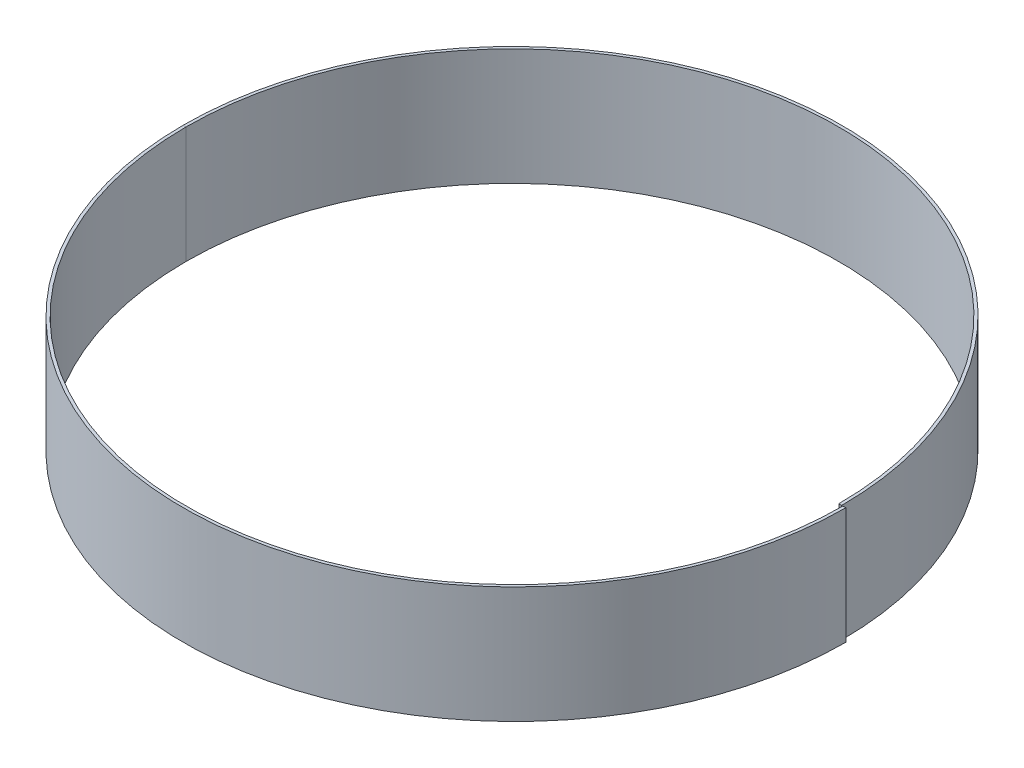
ISO-10303-21;
HEADER;
FILE_DESCRIPTION(('STEP AP214'),'2;1');
FILE_NAME('part.step','',(''),(''),'','','');
FILE_SCHEMA(('AUTOMOTIVE_DESIGN { 1 0 10303 214 1 1 1 1 }'));
ENDSEC;
DATA;
#1=APPLICATION_CONTEXT('core data for automotive mechanical design processes');
#2=APPLICATION_PROTOCOL_DEFINITION('international standard','automotive_design',2000,#1);
#3=PRODUCT_CONTEXT('',#1,'mechanical');
#4=PRODUCT('Part','Part','',(#3));
#5=PRODUCT_RELATED_PRODUCT_CATEGORY('part','',(#4));
#6=PRODUCT_DEFINITION_FORMATION('','',#4);
#7=PRODUCT_DEFINITION_CONTEXT('part definition',#1,'design');
#8=PRODUCT_DEFINITION('design','',#6,#7);
#9=PRODUCT_DEFINITION_SHAPE('','',#8);
#10=(LENGTH_UNIT() NAMED_UNIT(*) SI_UNIT(.MILLI.,.METRE.));
#11=(NAMED_UNIT(*) PLANE_ANGLE_UNIT() SI_UNIT($,.RADIAN.));
#12=(NAMED_UNIT(*) SI_UNIT($,.STERADIAN.) SOLID_ANGLE_UNIT());
#13=UNCERTAINTY_MEASURE_WITH_UNIT(LENGTH_MEASURE(1.E-05),#10,'distance_accuracy_value','');
#14=(GEOMETRIC_REPRESENTATION_CONTEXT(3) GLOBAL_UNCERTAINTY_ASSIGNED_CONTEXT((#13)) GLOBAL_UNIT_ASSIGNED_CONTEXT((#10,
#11,#12)) REPRESENTATION_CONTEXT('',''));
#15=CARTESIAN_POINT('',(0.,0.,0.));
#16=DIRECTION('',(0.,0.,1.));
#17=DIRECTION('',(1.,0.,0.));
#18=AXIS2_PLACEMENT_3D('',#15,#16,#17);
#19=CARTESIAN_POINT('',(28.,-5.,0.));
#20=DIRECTION('',(0.,0.,-1.));
#21=DIRECTION('',(0.,1.,0.));
#22=AXIS2_PLACEMENT_3D('',#19,#20,#21);
#23=PLANE('',#22);
#24=DIRECTION('',(-1.,0.,0.));
#25=VECTOR('',#24,1.);
#26=CARTESIAN_POINT('',(28.,-9.99999999999999,0.));
#27=LINE('',#26,#25);
#28=CARTESIAN_POINT('',(28.25,-9.99999999999999,0.));
#29=VERTEX_POINT('',#28);
#30=CARTESIAN_POINT('',(28.,-9.99999999999999,0.));
#31=VERTEX_POINT('',#30);
#32=EDGE_CURVE('E72',#29,#31,#27,.T.);
#33=ORIENTED_EDGE('',*,*,#32,.F.);
#34=DIRECTION('',(0.,-1.,0.));
#35=VECTOR('',#34,1.);
#36=CARTESIAN_POINT('',(28.25,83.9217284685272,0.));
#37=LINE('',#36,#35);
#38=CARTESIAN_POINT('',(28.25,0.,0.));
#39=VERTEX_POINT('',#38);
#40=EDGE_CURVE('E147',#29,#39,#37,.F.);
#41=ORIENTED_EDGE('',*,*,#40,.T.);
#42=DIRECTION('',(-1.,0.,0.));
#43=VECTOR('',#42,1.);
#44=CARTESIAN_POINT('',(28.,0.,0.));
#45=LINE('',#44,#43);
#46=CARTESIAN_POINT('',(28.,0.,0.));
#47=VERTEX_POINT('',#46);
#48=EDGE_CURVE('E58',#39,#47,#45,.T.);
#49=ORIENTED_EDGE('',*,*,#48,.T.);
#50=DIRECTION('',(0.,1.,0.));
#51=VECTOR('',#50,1.);
#52=CARTESIAN_POINT('',(28.,-9.99999999999999,0.));
#53=LINE('',#52,#51);
#54=EDGE_CURVE('E138',#31,#47,#53,.T.);
#55=ORIENTED_EDGE('',*,*,#54,.F.);
#56=EDGE_LOOP('',(#33,#41,#49,#55));
#57=FACE_BOUND('',#56,.T.);
#58=ADVANCED_FACE('F39',(#57),#23,.F.);
#59=CARTESIAN_POINT('',(0.,83.9217284685272,0.));
#60=DIRECTION('',(0.,-1.,0.));
#61=DIRECTION('',(0.,0.,-1.));
#62=AXIS2_PLACEMENT_3D('',#59,#60,#61);
#63=CYLINDRICAL_SURFACE('',#62,28.);
#64=CARTESIAN_POINT('',(0.,0.,0.));
#65=DIRECTION('',(0.,1.,0.));
#66=DIRECTION('',(0.,0.,1.));
#67=AXIS2_PLACEMENT_3D('',#64,#65,#66);
#68=CIRCLE('',#67,28.);
#69=CARTESIAN_POINT('',(-28.,0.,1.67335087613754E-13));
#70=VERTEX_POINT('',#69);
#71=EDGE_CURVE('E144',#47,#70,#68,.T.);
#72=ORIENTED_EDGE('',*,*,#71,.T.);
#73=DIRECTION('',(0.,1.,0.));
#74=VECTOR('',#73,1.);
#75=CARTESIAN_POINT('',(-28.,-10.,-3.88578058618805E-13));
#76=LINE('',#75,#74);
#77=CARTESIAN_POINT('',(-28.,-9.99999999999999,-1.78031315748604E-13));
#78=VERTEX_POINT('',#77);
#79=EDGE_CURVE('E43',#78,#70,#76,.T.);
#80=ORIENTED_EDGE('',*,*,#79,.F.);
#81=CARTESIAN_POINT('',(0.,-9.99999999999999,0.));
#82=DIRECTION('',(0.,-1.,0.));
#83=DIRECTION('',(0.,0.,-1.));
#84=AXIS2_PLACEMENT_3D('',#81,#82,#83);
#85=CIRCLE('',#84,28.);
#86=EDGE_CURVE('E141',#78,#31,#85,.T.);
#87=ORIENTED_EDGE('',*,*,#86,.T.);
#88=ORIENTED_EDGE('',*,*,#54,.T.);
#89=EDGE_LOOP('',(#72,#80,#87,#88));
#90=FACE_BOUND('',#89,.T.);
#91=ADVANCED_FACE('F155',(#90),#63,.F.);
#92=CARTESIAN_POINT('',(0.,-9.99999999999999,0.));
#93=DIRECTION('',(0.,1.,0.));
#94=DIRECTION('',(0.,0.,1.));
#95=AXIS2_PLACEMENT_3D('',#92,#93,#94);
#96=PLANE('',#95);
#97=DIRECTION('',(-1.,0.,0.));
#98=VECTOR('',#97,1.);
#99=CARTESIAN_POINT('',(-28.,-10.,-3.88578058618805E-13));
#100=LINE('',#99,#98);
#101=CARTESIAN_POINT('',(-28.25,-10.,-3.88578058618805E-13));
#102=VERTEX_POINT('',#101);
#103=EDGE_CURVE('E135',#78,#102,#100,.T.);
#104=ORIENTED_EDGE('',*,*,#103,.T.);
#105=CARTESIAN_POINT('',(0.,-9.99999999999999,0.));
#106=DIRECTION('',(0.,-1.,0.));
#107=DIRECTION('',(0.,0.,-1.));
#108=AXIS2_PLACEMENT_3D('',#105,#106,#107);
#109=CIRCLE('',#108,28.25);
#110=EDGE_CURVE('E132',#102,#29,#109,.T.);
#111=ORIENTED_EDGE('',*,*,#110,.T.);
#112=ORIENTED_EDGE('',*,*,#32,.T.);
#113=ORIENTED_EDGE('',*,*,#86,.F.);
#114=EDGE_LOOP('',(#104,#111,#112,#113));
#115=FACE_BOUND('',#114,.T.);
#116=ADVANCED_FACE('F159',(#115),#96,.F.);
#117=CARTESIAN_POINT('',(0.,83.9217284685272,0.));
#118=DIRECTION('',(0.,-1.,0.));
#119=DIRECTION('',(0.,0.,-1.));
#120=AXIS2_PLACEMENT_3D('',#117,#118,#119);
#121=CYLINDRICAL_SURFACE('',#120,28.25);
#122=CARTESIAN_POINT('',(0.,0.,0.));
#123=DIRECTION('',(0.,-1.,0.));
#124=DIRECTION('',(0.,0.,-1.));
#125=AXIS2_PLACEMENT_3D('',#122,#123,#124);
#126=CIRCLE('',#125,28.25);
#127=CARTESIAN_POINT('',(-28.25,0.,0.));
#128=VERTEX_POINT('',#127);
#129=EDGE_CURVE('E49',#39,#128,#126,.F.);
#130=ORIENTED_EDGE('',*,*,#129,.F.);
#131=ORIENTED_EDGE('',*,*,#40,.F.);
#132=ORIENTED_EDGE('',*,*,#110,.F.);
#133=DIRECTION('',(0.,1.,0.));
#134=VECTOR('',#133,1.);
#135=CARTESIAN_POINT('',(-28.25,-10.,-3.88578058618805E-13));
#136=LINE('',#135,#134);
#137=EDGE_CURVE('E117',#102,#128,#136,.T.);
#138=ORIENTED_EDGE('',*,*,#137,.T.);
#139=EDGE_LOOP('',(#130,#131,#132,#138));
#140=FACE_BOUND('',#139,.T.);
#141=ADVANCED_FACE('F157',(#140),#121,.T.);
#142=CARTESIAN_POINT('',(0.,0.,0.));
#143=DIRECTION('',(0.,-1.,0.));
#144=DIRECTION('',(0.,0.,-1.));
#145=AXIS2_PLACEMENT_3D('',#142,#143,#144);
#146=PLANE('',#145);
#147=ORIENTED_EDGE('',*,*,#48,.F.);
#148=ORIENTED_EDGE('',*,*,#129,.T.);
#149=DIRECTION('',(1.,0.,0.));
#150=VECTOR('',#149,1.);
#151=CARTESIAN_POINT('',(-28.25,0.,-3.88578058618805E-13));
#152=LINE('',#151,#150);
#153=EDGE_CURVE('E11',#128,#70,#152,.T.);
#154=ORIENTED_EDGE('',*,*,#153,.T.);
#155=ORIENTED_EDGE('',*,*,#71,.F.);
#156=EDGE_LOOP('',(#147,#148,#154,#155));
#157=FACE_BOUND('',#156,.T.);
#158=ADVANCED_FACE('F41',(#157),#146,.F.);
#159=CARTESIAN_POINT('',(0.174999999999998,-9.99999999999999,-3.83402395083908E-13));
#160=DIRECTION('',(0.,1.,0.));
#161=DIRECTION('',(0.,0.,1.));
#162=AXIS2_PLACEMENT_3D('',#159,#160,#161);
#163=PLANE('',#162);
#164=DIRECTION('',(-1.,0.,0.));
#165=VECTOR('',#164,1.);
#166=CARTESIAN_POINT('',(28.35,-9.99999999999999,-3.78871509518444E-13));
#167=LINE('',#166,#165);
#168=CARTESIAN_POINT('',(28.6,-9.99999999999999,-3.78831306452202E-13));
#169=VERTEX_POINT('',#168);
#170=CARTESIAN_POINT('',(28.35,-9.99999999999999,-3.78871509518444E-13));
#171=VERTEX_POINT('',#170);
#172=EDGE_CURVE('E101',#169,#171,#167,.T.);
#173=ORIENTED_EDGE('',*,*,#172,.F.);
#174=CARTESIAN_POINT('',(0.174999999999998,-9.99999999999999,-3.83402395083908E-13));
#175=DIRECTION('',(0.,-1.,0.));
#176=DIRECTION('',(0.,0.,-1.));
#177=AXIS2_PLACEMENT_3D('',#174,#175,#176);
#178=CIRCLE('',#177,28.425);
#179=EDGE_CURVE('E80',#169,#102,#178,.T.);
#180=ORIENTED_EDGE('',*,*,#179,.T.);
#181=ORIENTED_EDGE('',*,*,#103,.F.);
#182=CARTESIAN_POINT('',(0.174999999999998,-9.99999999999999,-3.83402395083908E-13));
#183=DIRECTION('',(0.,-1.,0.));
#184=DIRECTION('',(0.,0.,-1.));
#185=AXIS2_PLACEMENT_3D('',#182,#183,#184);
#186=CIRCLE('',#185,28.175);
#187=EDGE_CURVE('E105',#171,#78,#186,.T.);
#188=ORIENTED_EDGE('',*,*,#187,.F.);
#189=EDGE_LOOP('',(#173,#180,#181,#188));
#190=FACE_BOUND('',#189,.T.);
#191=ADVANCED_FACE('F102',(#190),#163,.F.);
#192=CARTESIAN_POINT('',(0.174999999999998,0.,-3.83402395083908E-13));
#193=DIRECTION('',(0.,-1.,0.));
#194=DIRECTION('',(0.,0.,-1.));
#195=AXIS2_PLACEMENT_3D('',#192,#193,#194);
#196=PLANE('',#195);
#197=ORIENTED_EDGE('',*,*,#153,.F.);
#198=CARTESIAN_POINT('',(0.174999999999998,0.,-3.83402395083908E-13));
#199=DIRECTION('',(0.,-1.,0.));
#200=DIRECTION('',(0.,0.,-1.));
#201=AXIS2_PLACEMENT_3D('',#198,#199,#200);
#202=CIRCLE('',#201,28.425);
#203=CARTESIAN_POINT('',(28.6,0.,-3.78831306452202E-13));
#204=VERTEX_POINT('',#203);
#205=EDGE_CURVE('E119',#128,#204,#202,.F.);
#206=ORIENTED_EDGE('',*,*,#205,.T.);
#207=DIRECTION('',(-1.,0.,0.));
#208=VECTOR('',#207,1.);
#209=CARTESIAN_POINT('',(28.35,0.,-3.81677173905609E-13));
#210=LINE('',#209,#208);
#211=CARTESIAN_POINT('',(28.35,0.,-3.81677173905609E-13));
#212=VERTEX_POINT('',#211);
#213=EDGE_CURVE('E89',#204,#212,#210,.T.);
#214=ORIENTED_EDGE('',*,*,#213,.T.);
#215=CARTESIAN_POINT('',(0.174999999999998,0.,-3.83402395083908E-13));
#216=DIRECTION('',(0.,1.,0.));
#217=DIRECTION('',(0.,0.,1.));
#218=AXIS2_PLACEMENT_3D('',#215,#216,#217);
#219=CIRCLE('',#218,28.175);
#220=EDGE_CURVE('E123',#70,#212,#219,.T.);
#221=ORIENTED_EDGE('',*,*,#220,.F.);
#222=EDGE_LOOP('',(#197,#206,#214,#221));
#223=FACE_BOUND('',#222,.T.);
#224=ADVANCED_FACE('F153',(#223),#196,.F.);
#225=CARTESIAN_POINT('',(28.35,-5.,-3.8068267568342E-13));
#226=DIRECTION('',(0.,0.,1.));
#227=DIRECTION('',(0.,-1.,0.));
#228=AXIS2_PLACEMENT_3D('',#225,#226,#227);
#229=PLANE('',#228);
#230=DIRECTION('',(0.,-1.,0.));
#231=VECTOR('',#230,1.);
#232=CARTESIAN_POINT('',(28.6,84.4680388115696,-3.78831306452202E-13));
#233=LINE('',#232,#231);
#234=EDGE_CURVE('E115',#204,#169,#233,.T.);
#235=ORIENTED_EDGE('',*,*,#234,.T.);
#236=ORIENTED_EDGE('',*,*,#172,.T.);
#237=DIRECTION('',(0.,-1.,0.));
#238=VECTOR('',#237,1.);
#239=CARTESIAN_POINT('',(28.35,0.,-3.8068267568342E-13));
#240=LINE('',#239,#238);
#241=EDGE_CURVE('E127',#212,#171,#240,.T.);
#242=ORIENTED_EDGE('',*,*,#241,.F.);
#243=ORIENTED_EDGE('',*,*,#213,.F.);
#244=EDGE_LOOP('',(#235,#236,#242,#243));
#245=FACE_BOUND('',#244,.T.);
#246=ADVANCED_FACE('F121',(#245),#229,.F.);
#247=CARTESIAN_POINT('',(0.174999999999998,84.4680388115696,-3.83402395083908E-13));
#248=DIRECTION('',(0.,-1.,0.));
#249=DIRECTION('',(0.,0.,-1.));
#250=AXIS2_PLACEMENT_3D('',#247,#248,#249);
#251=CYLINDRICAL_SURFACE('',#250,28.175);
#252=ORIENTED_EDGE('',*,*,#220,.T.);
#253=ORIENTED_EDGE('',*,*,#241,.T.);
#254=ORIENTED_EDGE('',*,*,#187,.T.);
#255=ORIENTED_EDGE('',*,*,#79,.T.);
#256=EDGE_LOOP('',(#252,#253,#254,#255));
#257=FACE_BOUND('',#256,.T.);
#258=ADVANCED_FACE('F150',(#257),#251,.F.);
#259=CARTESIAN_POINT('',(0.174999999999998,84.4680388115696,-3.83402395083908E-13));
#260=DIRECTION('',(0.,-1.,0.));
#261=DIRECTION('',(0.,0.,-1.));
#262=AXIS2_PLACEMENT_3D('',#259,#260,#261);
#263=CYLINDRICAL_SURFACE('',#262,28.425);
#264=ORIENTED_EDGE('',*,*,#205,.F.);
#265=ORIENTED_EDGE('',*,*,#137,.F.);
#266=ORIENTED_EDGE('',*,*,#179,.F.);
#267=ORIENTED_EDGE('',*,*,#234,.F.);
#268=EDGE_LOOP('',(#264,#265,#266,#267));
#269=FACE_BOUND('',#268,.T.);
#270=ADVANCED_FACE('F114',(#269),#263,.T.);
#271=CLOSED_SHELL('',(#58,#91,#116,#141,#158,#191,#224,#246,#258,#270));
#272=MANIFOLD_SOLID_BREP('B2',#271);
#273=ADVANCED_BREP_SHAPE_REPRESENTATION('',(#18,#272),#14);
#274=SHAPE_DEFINITION_REPRESENTATION(#9,#273);
ENDSEC;
END-ISO-10303-21;
